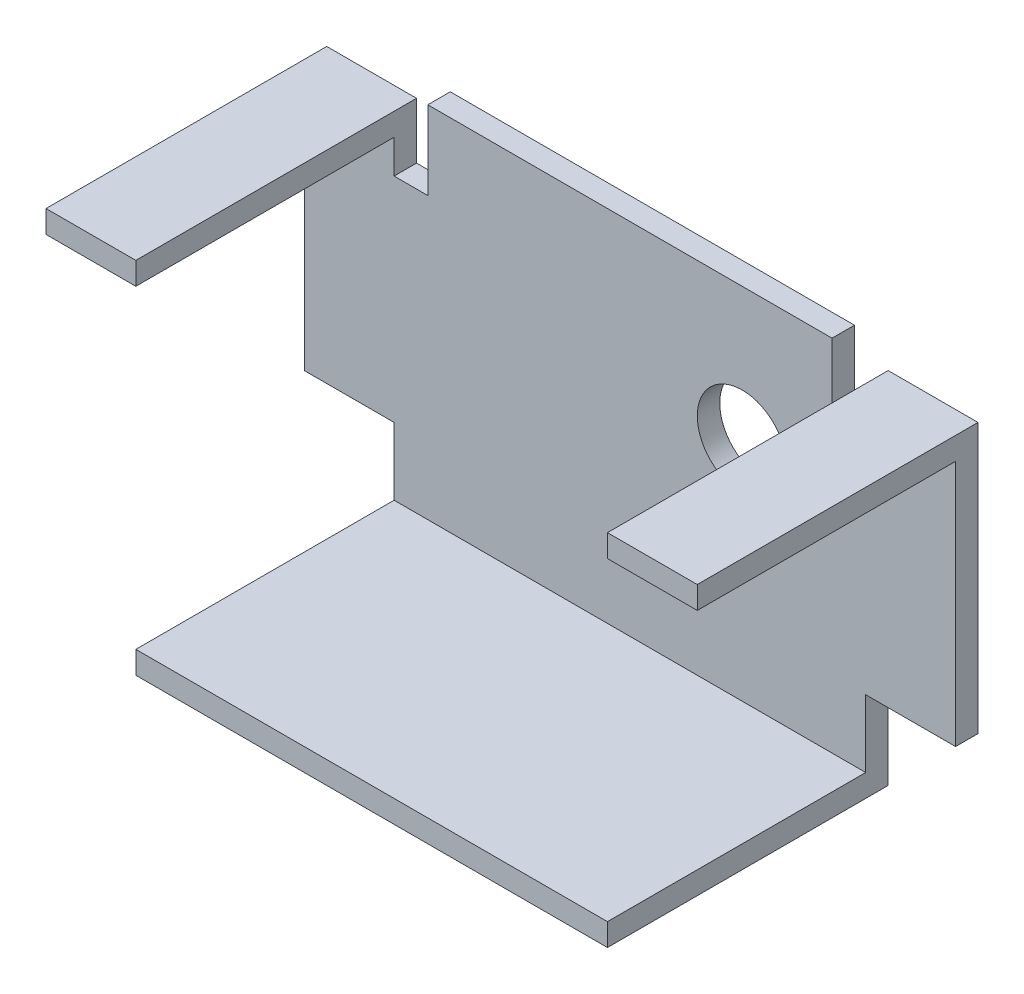
ISO-10303-21;
HEADER;
FILE_DESCRIPTION(('STEP AP214'),'2;1');
FILE_NAME('part.step','',(''),(''),'','','');
FILE_SCHEMA(('AUTOMOTIVE_DESIGN { 1 0 10303 214 1 1 1 1 }'));
ENDSEC;
DATA;
#1=APPLICATION_CONTEXT('core data for automotive mechanical design processes');
#2=APPLICATION_PROTOCOL_DEFINITION('international standard','automotive_design',2000,#1);
#3=PRODUCT_CONTEXT('',#1,'mechanical');
#4=PRODUCT('Part','Part','',(#3));
#5=PRODUCT_RELATED_PRODUCT_CATEGORY('part','',(#4));
#6=PRODUCT_DEFINITION_FORMATION('','',#4);
#7=PRODUCT_DEFINITION_CONTEXT('part definition',#1,'design');
#8=PRODUCT_DEFINITION('design','',#6,#7);
#9=PRODUCT_DEFINITION_SHAPE('','',#8);
#10=(LENGTH_UNIT() NAMED_UNIT(*) SI_UNIT(.MILLI.,.METRE.));
#11=(NAMED_UNIT(*) PLANE_ANGLE_UNIT() SI_UNIT($,.RADIAN.));
#12=(NAMED_UNIT(*) SI_UNIT($,.STERADIAN.) SOLID_ANGLE_UNIT());
#13=UNCERTAINTY_MEASURE_WITH_UNIT(LENGTH_MEASURE(1.E-05),#10,'distance_accuracy_value','');
#14=(GEOMETRIC_REPRESENTATION_CONTEXT(3) GLOBAL_UNCERTAINTY_ASSIGNED_CONTEXT((#13)) GLOBAL_UNIT_ASSIGNED_CONTEXT((#10,
#11,#12)) REPRESENTATION_CONTEXT('',''));
#15=CARTESIAN_POINT('',(0.,0.,0.));
#16=DIRECTION('',(0.,0.,1.));
#17=DIRECTION('',(1.,0.,0.));
#18=AXIS2_PLACEMENT_3D('',#15,#16,#17);
#19=CARTESIAN_POINT('',(0.,0.,-23.));
#20=DIRECTION('',(0.,0.,-1.));
#21=DIRECTION('',(-1.,0.,0.));
#22=AXIS2_PLACEMENT_3D('',#19,#20,#21);
#23=PLANE('',#22);
#24=CARTESIAN_POINT('',(-11.,21.9999999998767,-23.));
#25=DIRECTION('',(0.,0.,1.));
#26=DIRECTION('',(1.,0.,0.));
#27=AXIS2_PLACEMENT_3D('',#24,#25,#26);
#28=CIRCLE('',#27,4.);
#29=CARTESIAN_POINT('',(-7.,21.9999999998767,-23.));
#30=VERTEX_POINT('',#29);
#31=EDGE_CURVE('E385',#30,#30,#28,.T.);
#32=ORIENTED_EDGE('',*,*,#31,.F.);
#33=EDGE_LOOP('',(#32));
#34=FACE_BOUND('',#33,.T.);
#35=DIRECTION('',(1.,0.,0.));
#36=VECTOR('',#35,1.);
#37=CARTESIAN_POINT('',(8.,30.,-23.));
#38=LINE('',#37,#36);
#39=CARTESIAN_POINT('',(0.,30.,-23.));
#40=VERTEX_POINT('',#39);
#41=CARTESIAN_POINT('',(8.,30.,-23.));
#42=VERTEX_POINT('',#41);
#43=EDGE_CURVE('E191',#40,#42,#38,.T.);
#44=ORIENTED_EDGE('',*,*,#43,.F.);
#45=DIRECTION('',(0.,-1.,0.));
#46=VECTOR('',#45,1.);
#47=CARTESIAN_POINT('',(0.,32.,-23.));
#48=LINE('',#47,#46);
#49=CARTESIAN_POINT('',(0.,27.,-23.));
#50=VERTEX_POINT('',#49);
#51=EDGE_CURVE('E176',#40,#50,#48,.T.);
#52=ORIENTED_EDGE('',*,*,#51,.T.);
#53=DIRECTION('',(-1.,0.,0.));
#54=VECTOR('',#53,1.);
#55=CARTESIAN_POINT('',(0.,27.,-23.));
#56=LINE('',#55,#54);
#57=CARTESIAN_POINT('',(-3.,27.,-23.));
#58=VERTEX_POINT('',#57);
#59=EDGE_CURVE('E398',#50,#58,#56,.T.);
#60=ORIENTED_EDGE('',*,*,#59,.T.);
#61=DIRECTION('',(0.,1.,0.));
#62=VECTOR('',#61,1.);
#63=CARTESIAN_POINT('',(-3.,27.,-23.));
#64=LINE('',#63,#62);
#65=CARTESIAN_POINT('',(-3.,33.9999999998767,-23.));
#66=VERTEX_POINT('',#65);
#67=EDGE_CURVE('E390',#58,#66,#64,.T.);
#68=ORIENTED_EDGE('',*,*,#67,.T.);
#69=DIRECTION('',(-1.,0.,0.));
#70=VECTOR('',#69,1.);
#71=CARTESIAN_POINT('',(-3.,33.9999999998767,-23.));
#72=LINE('',#71,#70);
#73=CARTESIAN_POINT('',(-39.0000003932175,33.9999999998767,-23.));
#74=VERTEX_POINT('',#73);
#75=EDGE_CURVE('E413',#66,#74,#72,.T.);
#76=ORIENTED_EDGE('',*,*,#75,.T.);
#77=DIRECTION('',(0.,1.,0.));
#78=VECTOR('',#77,1.);
#79=CARTESIAN_POINT('',(-39.0000003932176,26.9999999998767,-23.));
#80=LINE('',#79,#78);
#81=CARTESIAN_POINT('',(-39.0000003932176,26.9999999998767,-23.));
#82=VERTEX_POINT('',#81);
#83=EDGE_CURVE('E420',#82,#74,#80,.T.);
#84=ORIENTED_EDGE('',*,*,#83,.F.);
#85=DIRECTION('',(1.,0.,0.));
#86=VECTOR('',#85,1.);
#87=CARTESIAN_POINT('',(-42.0000003932176,26.9999999998767,-23.));
#88=LINE('',#87,#86);
#89=CARTESIAN_POINT('',(-42.0000003932176,26.9999999998767,-23.));
#90=VERTEX_POINT('',#89);
#91=EDGE_CURVE('E445',#90,#82,#88,.T.);
#92=ORIENTED_EDGE('',*,*,#91,.F.);
#93=DIRECTION('',(0.,-1.,0.));
#94=VECTOR('',#93,1.);
#95=CARTESIAN_POINT('',(-42.0000003932176,31.9999999998767,-23.));
#96=LINE('',#95,#94);
#97=CARTESIAN_POINT('',(-42.0000003932176,29.9974917174477,-23.));
#98=VERTEX_POINT('',#97);
#99=EDGE_CURVE('E462',#98,#90,#96,.T.);
#100=ORIENTED_EDGE('',*,*,#99,.F.);
#101=DIRECTION('',(1.,0.,0.));
#102=VECTOR('',#101,1.);
#103=CARTESIAN_POINT('',(-50.,29.9974917174477,-23.));
#104=LINE('',#103,#102);
#105=CARTESIAN_POINT('',(-50.,29.9974917174477,-23.));
#106=VERTEX_POINT('',#105);
#107=EDGE_CURVE('E357',#106,#98,#104,.T.);
#108=ORIENTED_EDGE('',*,*,#107,.F.);
#109=DIRECTION('',(0.,1.,0.));
#110=VECTOR('',#109,1.);
#111=CARTESIAN_POINT('',(-50.,8.,-23.));
#112=LINE('',#111,#110);
#113=CARTESIAN_POINT('',(-50.,8.,-23.));
#114=VERTEX_POINT('',#113);
#115=EDGE_CURVE('E546',#114,#106,#112,.T.);
#116=ORIENTED_EDGE('',*,*,#115,.F.);
#117=DIRECTION('',(-1.,0.,0.));
#118=VECTOR('',#117,1.);
#119=CARTESIAN_POINT('',(-42.,8.,-23.));
#120=LINE('',#119,#118);
#121=CARTESIAN_POINT('',(-42.,8.,-23.));
#122=VERTEX_POINT('',#121);
#123=EDGE_CURVE('E557',#122,#114,#120,.T.);
#124=ORIENTED_EDGE('',*,*,#123,.F.);
#125=DIRECTION('',(0.,1.,0.));
#126=VECTOR('',#125,1.);
#127=CARTESIAN_POINT('',(-42.,2.,-23.));
#128=LINE('',#127,#126);
#129=CARTESIAN_POINT('',(-42.,2.,-23.));
#130=VERTEX_POINT('',#129);
#131=EDGE_CURVE('E565',#130,#122,#128,.T.);
#132=ORIENTED_EDGE('',*,*,#131,.F.);
#133=DIRECTION('',(1.,0.,0.));
#134=VECTOR('',#133,1.);
#135=CARTESIAN_POINT('',(-42.,2.,-23.));
#136=LINE('',#135,#134);
#137=CARTESIAN_POINT('',(0.,2.,-23.));
#138=VERTEX_POINT('',#137);
#139=EDGE_CURVE('E569',#130,#138,#136,.T.);
#140=ORIENTED_EDGE('',*,*,#139,.T.);
#141=DIRECTION('',(0.,1.,0.));
#142=VECTOR('',#141,1.);
#143=CARTESIAN_POINT('',(0.,2.,-23.));
#144=LINE('',#143,#142);
#145=CARTESIAN_POINT('',(0.,8.,-23.));
#146=VERTEX_POINT('',#145);
#147=EDGE_CURVE('E533',#138,#146,#144,.T.);
#148=ORIENTED_EDGE('',*,*,#147,.T.);
#149=DIRECTION('',(1.,0.,0.));
#150=VECTOR('',#149,1.);
#151=CARTESIAN_POINT('',(0.,8.,-23.));
#152=LINE('',#151,#150);
#153=CARTESIAN_POINT('',(8.,8.,-23.));
#154=VERTEX_POINT('',#153);
#155=EDGE_CURVE('E581',#146,#154,#152,.T.);
#156=ORIENTED_EDGE('',*,*,#155,.T.);
#157=DIRECTION('',(0.,1.,0.));
#158=VECTOR('',#157,1.);
#159=CARTESIAN_POINT('',(8.,8.,-23.));
#160=LINE('',#159,#158);
#161=EDGE_CURVE('E196',#154,#42,#160,.T.);
#162=ORIENTED_EDGE('',*,*,#161,.T.);
#163=EDGE_LOOP('',(#44,#52,#60,#68,#76,#84,#92,#100,#108,#116,#124,#132,#140,#148,#156,#162));
#164=FACE_BOUND('',#163,.T.);
#165=ADVANCED_FACE('F172',(#34,#164),#23,.F.);
#166=CARTESIAN_POINT('',(0.,2.,0.));
#167=DIRECTION('',(0.,-1.,0.));
#168=DIRECTION('',(0.,0.,-1.));
#169=AXIS2_PLACEMENT_3D('',#166,#167,#168);
#170=PLANE('',#169);
#171=ORIENTED_EDGE('',*,*,#139,.F.);
#172=DIRECTION('',(0.,0.,1.));
#173=VECTOR('',#172,1.);
#174=CARTESIAN_POINT('',(-42.,2.,0.));
#175=LINE('',#174,#173);
#176=CARTESIAN_POINT('',(-42.,2.,0.));
#177=VERTEX_POINT('',#176);
#178=EDGE_CURVE('E485',#130,#177,#175,.T.);
#179=ORIENTED_EDGE('',*,*,#178,.T.);
#180=DIRECTION('',(1.,0.,0.));
#181=VECTOR('',#180,1.);
#182=CARTESIAN_POINT('',(0.,2.,0.));
#183=LINE('',#182,#181);
#184=CARTESIAN_POINT('',(0.,2.,0.));
#185=VERTEX_POINT('',#184);
#186=EDGE_CURVE('E489',#177,#185,#183,.T.);
#187=ORIENTED_EDGE('',*,*,#186,.T.);
#188=DIRECTION('',(0.,0.,-1.));
#189=VECTOR('',#188,1.);
#190=CARTESIAN_POINT('',(0.,2.,-25.));
#191=LINE('',#190,#189);
#192=EDGE_CURVE('E490',#185,#138,#191,.T.);
#193=ORIENTED_EDGE('',*,*,#192,.T.);
#194=EDGE_LOOP('',(#171,#179,#187,#193));
#195=FACE_BOUND('',#194,.T.);
#196=ADVANCED_FACE('F716',(#195),#170,.F.);
#197=CARTESIAN_POINT('',(0.,2.,-25.));
#198=DIRECTION('',(-1.,0.,0.));
#199=DIRECTION('',(0.,0.,1.));
#200=AXIS2_PLACEMENT_3D('',#197,#198,#199);
#201=PLANE('',#200);
#202=DIRECTION('',(0.,0.,-1.));
#203=VECTOR('',#202,1.);
#204=CARTESIAN_POINT('',(0.,0.,-25.));
#205=LINE('',#204,#203);
#206=CARTESIAN_POINT('',(0.,0.,0.));
#207=VERTEX_POINT('',#206);
#208=CARTESIAN_POINT('',(0.,0.,-25.));
#209=VERTEX_POINT('',#208);
#210=EDGE_CURVE('E412',#207,#209,#205,.T.);
#211=ORIENTED_EDGE('',*,*,#210,.T.);
#212=DIRECTION('',(0.,-1.,0.));
#213=VECTOR('',#212,1.);
#214=CARTESIAN_POINT('',(0.,2.,-25.));
#215=LINE('',#214,#213);
#216=CARTESIAN_POINT('',(0.,8.,-25.));
#217=VERTEX_POINT('',#216);
#218=EDGE_CURVE('E12',#217,#209,#215,.T.);
#219=ORIENTED_EDGE('',*,*,#218,.F.);
#220=DIRECTION('',(0.,0.,1.));
#221=VECTOR('',#220,1.);
#222=CARTESIAN_POINT('',(0.,8.,-25.));
#223=LINE('',#222,#221);
#224=EDGE_CURVE('E578',#217,#146,#223,.T.);
#225=ORIENTED_EDGE('',*,*,#224,.T.);
#226=ORIENTED_EDGE('',*,*,#147,.F.);
#227=ORIENTED_EDGE('',*,*,#192,.F.);
#228=DIRECTION('',(0.,-1.,0.));
#229=VECTOR('',#228,1.);
#230=CARTESIAN_POINT('',(0.,2.,0.));
#231=LINE('',#230,#229);
#232=EDGE_CURVE('E499',#185,#207,#231,.T.);
#233=ORIENTED_EDGE('',*,*,#232,.T.);
#234=EDGE_LOOP('',(#211,#219,#225,#226,#227,#233));
#235=FACE_BOUND('',#234,.T.);
#236=ADVANCED_FACE('F174',(#235),#201,.F.);
#237=CARTESIAN_POINT('',(-42.,2.,-25.));
#238=DIRECTION('',(0.,0.,1.));
#239=DIRECTION('',(1.,0.,0.));
#240=AXIS2_PLACEMENT_3D('',#237,#238,#239);
#241=PLANE('',#240);
#242=CARTESIAN_POINT('',(-11.,21.9999999998767,-25.));
#243=DIRECTION('',(0.,0.,1.));
#244=DIRECTION('',(1.,0.,0.));
#245=AXIS2_PLACEMENT_3D('',#242,#243,#244);
#246=CIRCLE('',#245,4.);
#247=CARTESIAN_POINT('',(-7.,21.9999999998767,-25.));
#248=VERTEX_POINT('',#247);
#249=EDGE_CURVE('E386',#248,#248,#246,.T.);
#250=ORIENTED_EDGE('',*,*,#249,.T.);
#251=EDGE_LOOP('',(#250));
#252=FACE_BOUND('',#251,.T.);
#253=DIRECTION('',(-1.,0.,0.));
#254=VECTOR('',#253,1.);
#255=CARTESIAN_POINT('',(-42.,0.,-25.));
#256=LINE('',#255,#254);
#257=CARTESIAN_POINT('',(-42.,0.,-25.));
#258=VERTEX_POINT('',#257);
#259=EDGE_CURVE('E503',#209,#258,#256,.T.);
#260=ORIENTED_EDGE('',*,*,#259,.T.);
#261=DIRECTION('',(0.,-1.,0.));
#262=VECTOR('',#261,1.);
#263=CARTESIAN_POINT('',(-42.,2.,-25.));
#264=LINE('',#263,#262);
#265=CARTESIAN_POINT('',(-42.,8.,-25.));
#266=VERTEX_POINT('',#265);
#267=EDGE_CURVE('E183',#266,#258,#264,.T.);
#268=ORIENTED_EDGE('',*,*,#267,.F.);
#269=DIRECTION('',(-1.,0.,0.));
#270=VECTOR('',#269,1.);
#271=CARTESIAN_POINT('',(-42.,8.,-25.));
#272=LINE('',#271,#270);
#273=CARTESIAN_POINT('',(-50.,8.,-25.));
#274=VERTEX_POINT('',#273);
#275=EDGE_CURVE('E554',#266,#274,#272,.T.);
#276=ORIENTED_EDGE('',*,*,#275,.T.);
#277=DIRECTION('',(0.,1.,0.));
#278=VECTOR('',#277,1.);
#279=CARTESIAN_POINT('',(-50.,8.,-25.));
#280=LINE('',#279,#278);
#281=CARTESIAN_POINT('',(-50.,31.9974917174477,-25.));
#282=VERTEX_POINT('',#281);
#283=EDGE_CURVE('E543',#274,#282,#280,.T.);
#284=ORIENTED_EDGE('',*,*,#283,.T.);
#285=DIRECTION('',(0.999999950847806,0.000313535303626128,0.));
#286=VECTOR('',#285,1.);
#287=CARTESIAN_POINT('',(-50.,31.9974917174477,-25.));
#288=LINE('',#287,#286);
#289=CARTESIAN_POINT('',(-42.0000003932176,31.9999999998767,-25.));
#290=VERTEX_POINT('',#289);
#291=EDGE_CURVE('E472',#282,#290,#288,.T.);
#292=ORIENTED_EDGE('',*,*,#291,.T.);
#293=DIRECTION('',(0.,-1.,0.));
#294=VECTOR('',#293,1.);
#295=CARTESIAN_POINT('',(-42.0000003932176,31.9999999998767,-25.));
#296=LINE('',#295,#294);
#297=CARTESIAN_POINT('',(-42.0000003932176,26.9999999998767,-25.));
#298=VERTEX_POINT('',#297);
#299=EDGE_CURVE('E459',#290,#298,#296,.T.);
#300=ORIENTED_EDGE('',*,*,#299,.T.);
#301=DIRECTION('',(1.,0.,0.));
#302=VECTOR('',#301,1.);
#303=CARTESIAN_POINT('',(-42.0000003932176,26.9999999998767,-25.));
#304=LINE('',#303,#302);
#305=CARTESIAN_POINT('',(-39.0000003932176,26.9999999998767,-25.));
#306=VERTEX_POINT('',#305);
#307=EDGE_CURVE('E442',#298,#306,#304,.T.);
#308=ORIENTED_EDGE('',*,*,#307,.T.);
#309=DIRECTION('',(0.,1.,0.));
#310=VECTOR('',#309,1.);
#311=CARTESIAN_POINT('',(-39.0000003932176,26.9999999998767,-25.));
#312=LINE('',#311,#310);
#313=CARTESIAN_POINT('',(-39.0000003932175,33.9999999998767,-25.));
#314=VERTEX_POINT('',#313);
#315=EDGE_CURVE('E416',#306,#314,#312,.T.);
#316=ORIENTED_EDGE('',*,*,#315,.T.);
#317=DIRECTION('',(-1.,0.,0.));
#318=VECTOR('',#317,1.);
#319=CARTESIAN_POINT('',(-3.,33.9999999998767,-25.));
#320=LINE('',#319,#318);
#321=CARTESIAN_POINT('',(-3.,33.9999999998767,-25.));
#322=VERTEX_POINT('',#321);
#323=EDGE_CURVE('E408',#322,#314,#320,.T.);
#324=ORIENTED_EDGE('',*,*,#323,.F.);
#325=DIRECTION('',(0.,1.,0.));
#326=VECTOR('',#325,1.);
#327=CARTESIAN_POINT('',(-3.,27.,-25.));
#328=LINE('',#327,#326);
#329=CARTESIAN_POINT('',(-3.,27.,-25.));
#330=VERTEX_POINT('',#329);
#331=EDGE_CURVE('E399',#330,#322,#328,.T.);
#332=ORIENTED_EDGE('',*,*,#331,.F.);
#333=DIRECTION('',(-1.,0.,0.));
#334=VECTOR('',#333,1.);
#335=CARTESIAN_POINT('',(0.,27.,-25.));
#336=LINE('',#335,#334);
#337=CARTESIAN_POINT('',(0.,27.,-25.));
#338=VERTEX_POINT('',#337);
#339=EDGE_CURVE('E601',#338,#330,#336,.T.);
#340=ORIENTED_EDGE('',*,*,#339,.F.);
#341=DIRECTION('',(0.,-1.,0.));
#342=VECTOR('',#341,1.);
#343=CARTESIAN_POINT('',(0.,32.,-25.));
#344=LINE('',#343,#342);
#345=CARTESIAN_POINT('',(0.,32.,-25.));
#346=VERTEX_POINT('',#345);
#347=EDGE_CURVE('E336',#346,#338,#344,.T.);
#348=ORIENTED_EDGE('',*,*,#347,.F.);
#349=DIRECTION('',(-1.,0.,0.));
#350=VECTOR('',#349,1.);
#351=CARTESIAN_POINT('',(8.,32.,-25.));
#352=LINE('',#351,#350);
#353=CARTESIAN_POINT('',(8.,32.,-25.));
#354=VERTEX_POINT('',#353);
#355=EDGE_CURVE('E335',#354,#346,#352,.T.);
#356=ORIENTED_EDGE('',*,*,#355,.F.);
#357=DIRECTION('',(0.,1.,0.));
#358=VECTOR('',#357,1.);
#359=CARTESIAN_POINT('',(8.,8.,-25.));
#360=LINE('',#359,#358);
#361=CARTESIAN_POINT('',(8.,8.,-25.));
#362=VERTEX_POINT('',#361);
#363=EDGE_CURVE('E330',#362,#354,#360,.T.);
#364=ORIENTED_EDGE('',*,*,#363,.F.);
#365=DIRECTION('',(1.,0.,0.));
#366=VECTOR('',#365,1.);
#367=CARTESIAN_POINT('',(0.,8.,-25.));
#368=LINE('',#367,#366);
#369=EDGE_CURVE('E574',#217,#362,#368,.T.);
#370=ORIENTED_EDGE('',*,*,#369,.F.);
#371=ORIENTED_EDGE('',*,*,#218,.T.);
#372=EDGE_LOOP('',(#260,#268,#276,#284,#292,#300,#308,#316,#324,#332,#340,#348,#356,#364,#370,#371));
#373=FACE_BOUND('',#372,.T.);
#374=ADVANCED_FACE('F679',(#252,#373),#241,.F.);
#375=CARTESIAN_POINT('',(-42.,2.,0.));
#376=DIRECTION('',(1.,0.,0.));
#377=DIRECTION('',(0.,0.,-1.));
#378=AXIS2_PLACEMENT_3D('',#375,#376,#377);
#379=PLANE('',#378);
#380=DIRECTION('',(0.,0.,1.));
#381=VECTOR('',#380,1.);
#382=CARTESIAN_POINT('',(-42.,0.,0.));
#383=LINE('',#382,#381);
#384=CARTESIAN_POINT('',(-42.,0.,0.));
#385=VERTEX_POINT('',#384);
#386=EDGE_CURVE('E506',#258,#385,#383,.T.);
#387=ORIENTED_EDGE('',*,*,#386,.T.);
#388=DIRECTION('',(0.,-1.,0.));
#389=VECTOR('',#388,1.);
#390=CARTESIAN_POINT('',(-42.,2.,0.));
#391=LINE('',#390,#389);
#392=EDGE_CURVE('E484',#177,#385,#391,.T.);
#393=ORIENTED_EDGE('',*,*,#392,.F.);
#394=ORIENTED_EDGE('',*,*,#178,.F.);
#395=ORIENTED_EDGE('',*,*,#131,.T.);
#396=DIRECTION('',(0.,0.,1.));
#397=VECTOR('',#396,1.);
#398=CARTESIAN_POINT('',(-42.,8.,-25.));
#399=LINE('',#398,#397);
#400=EDGE_CURVE('E561',#266,#122,#399,.T.);
#401=ORIENTED_EDGE('',*,*,#400,.F.);
#402=ORIENTED_EDGE('',*,*,#267,.T.);
#403=EDGE_LOOP('',(#387,#393,#394,#395,#401,#402));
#404=FACE_BOUND('',#403,.T.);
#405=ADVANCED_FACE('F715',(#404),#379,.F.);
#406=CARTESIAN_POINT('',(0.,2.,0.));
#407=DIRECTION('',(0.,0.,-1.));
#408=DIRECTION('',(-1.,0.,0.));
#409=AXIS2_PLACEMENT_3D('',#406,#407,#408);
#410=PLANE('',#409);
#411=DIRECTION('',(1.,0.,0.));
#412=VECTOR('',#411,1.);
#413=CARTESIAN_POINT('',(0.,0.,0.));
#414=LINE('',#413,#412);
#415=EDGE_CURVE('E509',#385,#207,#414,.T.);
#416=ORIENTED_EDGE('',*,*,#415,.T.);
#417=ORIENTED_EDGE('',*,*,#232,.F.);
#418=ORIENTED_EDGE('',*,*,#186,.F.);
#419=ORIENTED_EDGE('',*,*,#392,.T.);
#420=EDGE_LOOP('',(#416,#417,#418,#419));
#421=FACE_BOUND('',#420,.T.);
#422=ADVANCED_FACE('F520',(#421),#410,.F.);
#423=CARTESIAN_POINT('',(0.,0.,0.));
#424=DIRECTION('',(0.,-1.,0.));
#425=DIRECTION('',(0.,0.,-1.));
#426=AXIS2_PLACEMENT_3D('',#423,#424,#425);
#427=PLANE('',#426);
#428=ORIENTED_EDGE('',*,*,#210,.F.);
#429=ORIENTED_EDGE('',*,*,#415,.F.);
#430=ORIENTED_EDGE('',*,*,#386,.F.);
#431=ORIENTED_EDGE('',*,*,#259,.F.);
#432=EDGE_LOOP('',(#428,#429,#430,#431));
#433=FACE_BOUND('',#432,.T.);
#434=ADVANCED_FACE('F527',(#433),#427,.T.);
#435=CARTESIAN_POINT('',(-3.,27.,-25.));
#436=DIRECTION('',(1.,0.,0.));
#437=DIRECTION('',(0.,0.,-1.));
#438=AXIS2_PLACEMENT_3D('',#435,#436,#437);
#439=PLANE('',#438);
#440=ORIENTED_EDGE('',*,*,#67,.F.);
#441=DIRECTION('',(0.,0.,1.));
#442=VECTOR('',#441,1.);
#443=CARTESIAN_POINT('',(-3.,27.,-25.));
#444=LINE('',#443,#442);
#445=EDGE_CURVE('E405',#330,#58,#444,.T.);
#446=ORIENTED_EDGE('',*,*,#445,.F.);
#447=ORIENTED_EDGE('',*,*,#331,.T.);
#448=DIRECTION('',(0.,0.,1.));
#449=VECTOR('',#448,1.);
#450=CARTESIAN_POINT('',(-3.,33.9999999998767,-25.));
#451=LINE('',#450,#449);
#452=EDGE_CURVE('E394',#322,#66,#451,.T.);
#453=ORIENTED_EDGE('',*,*,#452,.T.);
#454=EDGE_LOOP('',(#440,#446,#447,#453));
#455=FACE_BOUND('',#454,.T.);
#456=ADVANCED_FACE('F671',(#455),#439,.T.);
#457=CARTESIAN_POINT('',(0.,27.,-25.));
#458=DIRECTION('',(0.,1.,0.));
#459=DIRECTION('',(0.,0.,1.));
#460=AXIS2_PLACEMENT_3D('',#457,#458,#459);
#461=PLANE('',#460);
#462=ORIENTED_EDGE('',*,*,#59,.F.);
#463=DIRECTION('',(0.,0.,1.));
#464=VECTOR('',#463,1.);
#465=CARTESIAN_POINT('',(0.,27.,-25.));
#466=LINE('',#465,#464);
#467=EDGE_CURVE('E604',#338,#50,#466,.T.);
#468=ORIENTED_EDGE('',*,*,#467,.F.);
#469=ORIENTED_EDGE('',*,*,#339,.T.);
#470=ORIENTED_EDGE('',*,*,#445,.T.);
#471=EDGE_LOOP('',(#462,#468,#469,#470));
#472=FACE_BOUND('',#471,.T.);
#473=ADVANCED_FACE('F668',(#472),#461,.T.);
#474=CARTESIAN_POINT('',(0.,32.,-25.));
#475=DIRECTION('',(-1.,0.,0.));
#476=DIRECTION('',(0.,-1.,0.));
#477=AXIS2_PLACEMENT_3D('',#474,#475,#476);
#478=PLANE('',#477);
#479=ORIENTED_EDGE('',*,*,#51,.F.);
#480=DIRECTION('',(0.,0.,-1.));
#481=VECTOR('',#480,1.);
#482=CARTESIAN_POINT('',(0.,30.,0.));
#483=LINE('',#482,#481);
#484=CARTESIAN_POINT('',(0.,30.,0.));
#485=VERTEX_POINT('',#484);
#486=EDGE_CURVE('E1007',#485,#40,#483,.T.);
#487=ORIENTED_EDGE('',*,*,#486,.F.);
#488=DIRECTION('',(0.,-1.,0.));
#489=VECTOR('',#488,1.);
#490=CARTESIAN_POINT('',(0.,30.,0.));
#491=LINE('',#490,#489);
#492=CARTESIAN_POINT('',(0.,32.,0.));
#493=VERTEX_POINT('',#492);
#494=EDGE_CURVE('E353',#493,#485,#491,.T.);
#495=ORIENTED_EDGE('',*,*,#494,.F.);
#496=DIRECTION('',(0.,0.,1.));
#497=VECTOR('',#496,1.);
#498=CARTESIAN_POINT('',(0.,32.,-25.));
#499=LINE('',#498,#497);
#500=EDGE_CURVE('E350',#346,#493,#499,.T.);
#501=ORIENTED_EDGE('',*,*,#500,.F.);
#502=ORIENTED_EDGE('',*,*,#347,.T.);
#503=ORIENTED_EDGE('',*,*,#467,.T.);
#504=EDGE_LOOP('',(#479,#487,#495,#501,#502,#503));
#505=FACE_BOUND('',#504,.T.);
#506=ADVANCED_FACE('F677',(#505),#478,.T.);
#507=CARTESIAN_POINT('',(8.,32.,-25.));
#508=DIRECTION('',(0.,1.,0.));
#509=DIRECTION('',(0.,0.,1.));
#510=AXIS2_PLACEMENT_3D('',#507,#508,#509);
#511=PLANE('',#510);
#512=ORIENTED_EDGE('',*,*,#500,.T.);
#513=DIRECTION('',(-1.,0.,0.));
#514=VECTOR('',#513,1.);
#515=CARTESIAN_POINT('',(0.,32.,0.));
#516=LINE('',#515,#514);
#517=CARTESIAN_POINT('',(8.,32.,0.));
#518=VERTEX_POINT('',#517);
#519=EDGE_CURVE('E341',#518,#493,#516,.T.);
#520=ORIENTED_EDGE('',*,*,#519,.F.);
#521=DIRECTION('',(0.,0.,1.));
#522=VECTOR('',#521,1.);
#523=CARTESIAN_POINT('',(8.,32.,-25.));
#524=LINE('',#523,#522);
#525=EDGE_CURVE('E324',#354,#518,#524,.T.);
#526=ORIENTED_EDGE('',*,*,#525,.F.);
#527=ORIENTED_EDGE('',*,*,#355,.T.);
#528=EDGE_LOOP('',(#512,#520,#526,#527));
#529=FACE_BOUND('',#528,.T.);
#530=ADVANCED_FACE('F348',(#529),#511,.T.);
#531=CARTESIAN_POINT('',(8.,8.,-25.));
#532=DIRECTION('',(1.,0.,0.));
#533=DIRECTION('',(0.,0.,-1.));
#534=AXIS2_PLACEMENT_3D('',#531,#532,#533);
#535=PLANE('',#534);
#536=ORIENTED_EDGE('',*,*,#161,.F.);
#537=DIRECTION('',(0.,0.,1.));
#538=VECTOR('',#537,1.);
#539=CARTESIAN_POINT('',(8.,8.,-25.));
#540=LINE('',#539,#538);
#541=EDGE_CURVE('E586',#362,#154,#540,.T.);
#542=ORIENTED_EDGE('',*,*,#541,.F.);
#543=ORIENTED_EDGE('',*,*,#363,.T.);
#544=ORIENTED_EDGE('',*,*,#525,.T.);
#545=DIRECTION('',(0.,1.,0.));
#546=VECTOR('',#545,1.);
#547=CARTESIAN_POINT('',(8.,32.,0.));
#548=LINE('',#547,#546);
#549=CARTESIAN_POINT('',(8.,30.,0.));
#550=VERTEX_POINT('',#549);
#551=EDGE_CURVE('E328',#550,#518,#548,.T.);
#552=ORIENTED_EDGE('',*,*,#551,.F.);
#553=DIRECTION('',(0.,0.,-1.));
#554=VECTOR('',#553,1.);
#555=CARTESIAN_POINT('',(8.,30.,0.));
#556=LINE('',#555,#554);
#557=EDGE_CURVE('E346',#550,#42,#556,.T.);
#558=ORIENTED_EDGE('',*,*,#557,.T.);
#559=EDGE_LOOP('',(#536,#542,#543,#544,#552,#558));
#560=FACE_BOUND('',#559,.T.);
#561=ADVANCED_FACE('F326',(#560),#535,.T.);
#562=CARTESIAN_POINT('',(0.,8.,-25.));
#563=DIRECTION('',(0.,-1.,0.));
#564=DIRECTION('',(0.,0.,-1.));
#565=AXIS2_PLACEMENT_3D('',#562,#563,#564);
#566=PLANE('',#565);
#567=ORIENTED_EDGE('',*,*,#155,.F.);
#568=ORIENTED_EDGE('',*,*,#224,.F.);
#569=ORIENTED_EDGE('',*,*,#369,.T.);
#570=ORIENTED_EDGE('',*,*,#541,.T.);
#571=EDGE_LOOP('',(#567,#568,#569,#570));
#572=FACE_BOUND('',#571,.T.);
#573=ADVANCED_FACE('F765',(#572),#566,.T.);
#574=CARTESIAN_POINT('',(-3.,33.9999999998767,-25.));
#575=DIRECTION('',(0.,1.,0.));
#576=DIRECTION('',(0.,0.,1.));
#577=AXIS2_PLACEMENT_3D('',#574,#575,#576);
#578=PLANE('',#577);
#579=ORIENTED_EDGE('',*,*,#75,.F.);
#580=ORIENTED_EDGE('',*,*,#452,.F.);
#581=ORIENTED_EDGE('',*,*,#323,.T.);
#582=DIRECTION('',(0.,0.,1.));
#583=VECTOR('',#582,1.);
#584=CARTESIAN_POINT('',(-39.0000003932176,33.9999999998767,-25.));
#585=LINE('',#584,#583);
#586=EDGE_CURVE('E419',#314,#74,#585,.T.);
#587=ORIENTED_EDGE('',*,*,#586,.T.);
#588=EDGE_LOOP('',(#579,#580,#581,#587));
#589=FACE_BOUND('',#588,.T.);
#590=ADVANCED_FACE('F683',(#589),#578,.T.);
#591=CARTESIAN_POINT('',(-42.,8.,-25.));
#592=DIRECTION('',(0.,1.,0.));
#593=DIRECTION('',(0.,0.,1.));
#594=AXIS2_PLACEMENT_3D('',#591,#592,#593);
#595=PLANE('',#594);
#596=ORIENTED_EDGE('',*,*,#123,.T.);
#597=DIRECTION('',(0.,0.,1.));
#598=VECTOR('',#597,1.);
#599=CARTESIAN_POINT('',(-50.,8.,-25.));
#600=LINE('',#599,#598);
#601=EDGE_CURVE('E550',#274,#114,#600,.T.);
#602=ORIENTED_EDGE('',*,*,#601,.F.);
#603=ORIENTED_EDGE('',*,*,#275,.F.);
#604=ORIENTED_EDGE('',*,*,#400,.T.);
#605=EDGE_LOOP('',(#596,#602,#603,#604));
#606=FACE_BOUND('',#605,.T.);
#607=ADVANCED_FACE('F712',(#606),#595,.F.);
#608=CARTESIAN_POINT('',(-50.,8.,-25.));
#609=DIRECTION('',(1.,0.,0.));
#610=DIRECTION('',(0.,0.,-1.));
#611=AXIS2_PLACEMENT_3D('',#608,#609,#610);
#612=PLANE('',#611);
#613=ORIENTED_EDGE('',*,*,#115,.T.);
#614=DIRECTION('',(0.,0.,-1.));
#615=VECTOR('',#614,1.);
#616=CARTESIAN_POINT('',(-50.,29.9974917174477,0.));
#617=LINE('',#616,#615);
#618=CARTESIAN_POINT('',(-50.,29.9974917174477,0.));
#619=VERTEX_POINT('',#618);
#620=EDGE_CURVE('E382',#619,#106,#617,.T.);
#621=ORIENTED_EDGE('',*,*,#620,.F.);
#622=DIRECTION('',(0.,-1.,0.));
#623=VECTOR('',#622,1.);
#624=CARTESIAN_POINT('',(-50.,31.9974917174477,0.));
#625=LINE('',#624,#623);
#626=CARTESIAN_POINT('',(-50.,31.9974917174477,0.));
#627=VERTEX_POINT('',#626);
#628=EDGE_CURVE('E366',#627,#619,#625,.T.);
#629=ORIENTED_EDGE('',*,*,#628,.F.);
#630=DIRECTION('',(0.,0.,1.));
#631=VECTOR('',#630,1.);
#632=CARTESIAN_POINT('',(-50.,31.9974917174477,-25.));
#633=LINE('',#632,#631);
#634=EDGE_CURVE('E541',#282,#627,#633,.T.);
#635=ORIENTED_EDGE('',*,*,#634,.F.);
#636=ORIENTED_EDGE('',*,*,#283,.F.);
#637=ORIENTED_EDGE('',*,*,#601,.T.);
#638=EDGE_LOOP('',(#613,#621,#629,#635,#636,#637));
#639=FACE_BOUND('',#638,.T.);
#640=ADVANCED_FACE('F705',(#639),#612,.F.);
#641=CARTESIAN_POINT('',(-50.,31.9974917174477,-25.));
#642=DIRECTION('',(0.000313535303626128,-0.999999950847806,0.));
#643=DIRECTION('',(0.999999950847806,0.000313535303626128,0.));
#644=AXIS2_PLACEMENT_3D('',#641,#642,#643);
#645=PLANE('',#644);
#646=ORIENTED_EDGE('',*,*,#634,.T.);
#647=DIRECTION('',(-0.999999950847805,-0.000313535303626128,0.));
#648=VECTOR('',#647,1.);
#649=CARTESIAN_POINT('',(-42.0000003932176,31.9999999998767,0.));
#650=LINE('',#649,#648);
#651=CARTESIAN_POINT('',(-42.0000003932176,31.9999999998767,0.));
#652=VERTEX_POINT('',#651);
#653=EDGE_CURVE('E362',#652,#627,#650,.T.);
#654=ORIENTED_EDGE('',*,*,#653,.F.);
#655=DIRECTION('',(0.,0.,1.));
#656=VECTOR('',#655,1.);
#657=CARTESIAN_POINT('',(-42.0000003932176,31.9999999998767,-25.));
#658=LINE('',#657,#656);
#659=EDGE_CURVE('E476',#290,#652,#658,.T.);
#660=ORIENTED_EDGE('',*,*,#659,.F.);
#661=ORIENTED_EDGE('',*,*,#291,.F.);
#662=EDGE_LOOP('',(#646,#654,#660,#661));
#663=FACE_BOUND('',#662,.T.);
#664=ADVANCED_FACE('F773',(#663),#645,.F.);
#665=CARTESIAN_POINT('',(-42.0000003932176,31.9999999998767,-25.));
#666=DIRECTION('',(-1.,0.,0.));
#667=DIRECTION('',(0.,0.,1.));
#668=AXIS2_PLACEMENT_3D('',#665,#666,#667);
#669=PLANE('',#668);
#670=ORIENTED_EDGE('',*,*,#659,.T.);
#671=DIRECTION('',(0.,1.,0.));
#672=VECTOR('',#671,1.);
#673=CARTESIAN_POINT('',(-42.0000003932176,29.9974917174477,0.));
#674=LINE('',#673,#672);
#675=CARTESIAN_POINT('',(-42.0000003932176,29.9974917174477,0.));
#676=VERTEX_POINT('',#675);
#677=EDGE_CURVE('E372',#676,#652,#674,.T.);
#678=ORIENTED_EDGE('',*,*,#677,.F.);
#679=DIRECTION('',(0.,0.,-1.));
#680=VECTOR('',#679,1.);
#681=CARTESIAN_POINT('',(-42.0000003932176,29.9974917174477,0.));
#682=LINE('',#681,#680);
#683=EDGE_CURVE('E376',#676,#98,#682,.T.);
#684=ORIENTED_EDGE('',*,*,#683,.T.);
#685=ORIENTED_EDGE('',*,*,#99,.T.);
#686=DIRECTION('',(0.,0.,1.));
#687=VECTOR('',#686,1.);
#688=CARTESIAN_POINT('',(-42.0000003932176,26.9999999998767,-25.));
#689=LINE('',#688,#687);
#690=EDGE_CURVE('E456',#298,#90,#689,.T.);
#691=ORIENTED_EDGE('',*,*,#690,.F.);
#692=ORIENTED_EDGE('',*,*,#299,.F.);
#693=EDGE_LOOP('',(#670,#678,#684,#685,#691,#692));
#694=FACE_BOUND('',#693,.T.);
#695=ADVANCED_FACE('F696',(#694),#669,.F.);
#696=CARTESIAN_POINT('',(-42.0000003932176,26.9999999998767,-25.));
#697=DIRECTION('',(0.,-1.,0.));
#698=DIRECTION('',(0.,0.,-1.));
#699=AXIS2_PLACEMENT_3D('',#696,#697,#698);
#700=PLANE('',#699);
#701=ORIENTED_EDGE('',*,*,#91,.T.);
#702=DIRECTION('',(0.,0.,1.));
#703=VECTOR('',#702,1.);
#704=CARTESIAN_POINT('',(-39.0000003932176,26.9999999998767,-25.));
#705=LINE('',#704,#703);
#706=EDGE_CURVE('E439',#306,#82,#705,.T.);
#707=ORIENTED_EDGE('',*,*,#706,.F.);
#708=ORIENTED_EDGE('',*,*,#307,.F.);
#709=ORIENTED_EDGE('',*,*,#690,.T.);
#710=EDGE_LOOP('',(#701,#707,#708,#709));
#711=FACE_BOUND('',#710,.T.);
#712=ADVANCED_FACE('F693',(#711),#700,.F.);
#713=CARTESIAN_POINT('',(-39.0000003932176,26.9999999998767,-25.));
#714=DIRECTION('',(1.,0.,0.));
#715=DIRECTION('',(0.,0.,-1.));
#716=AXIS2_PLACEMENT_3D('',#713,#714,#715);
#717=PLANE('',#716);
#718=ORIENTED_EDGE('',*,*,#83,.T.);
#719=ORIENTED_EDGE('',*,*,#586,.F.);
#720=ORIENTED_EDGE('',*,*,#315,.F.);
#721=ORIENTED_EDGE('',*,*,#706,.T.);
#722=EDGE_LOOP('',(#718,#719,#720,#721));
#723=FACE_BOUND('',#722,.T.);
#724=ADVANCED_FACE('F685',(#723),#717,.F.);
#725=CARTESIAN_POINT('',(-11.,21.9999999998767,-25.));
#726=DIRECTION('',(0.,0.,1.));
#727=DIRECTION('',(1.,0.,0.));
#728=AXIS2_PLACEMENT_3D('',#725,#726,#727);
#729=CYLINDRICAL_SURFACE('',#728,4.);
#730=ORIENTED_EDGE('',*,*,#249,.F.);
#731=EDGE_LOOP('',(#730));
#732=FACE_BOUND('',#731,.T.);
#733=ORIENTED_EDGE('',*,*,#31,.T.);
#734=EDGE_LOOP('',(#733));
#735=FACE_BOUND('',#734,.T.);
#736=ADVANCED_FACE('F740',(#732,#735),#729,.F.);
#737=CARTESIAN_POINT('',(-50.,29.9974917174477,0.));
#738=DIRECTION('',(0.,1.,0.));
#739=DIRECTION('',(0.,0.,1.));
#740=AXIS2_PLACEMENT_3D('',#737,#738,#739);
#741=PLANE('',#740);
#742=ORIENTED_EDGE('',*,*,#107,.T.);
#743=ORIENTED_EDGE('',*,*,#683,.F.);
#744=DIRECTION('',(1.,0.,0.));
#745=VECTOR('',#744,1.);
#746=CARTESIAN_POINT('',(-50.,29.9974917174477,0.));
#747=LINE('',#746,#745);
#748=EDGE_CURVE('E369',#619,#676,#747,.T.);
#749=ORIENTED_EDGE('',*,*,#748,.F.);
#750=ORIENTED_EDGE('',*,*,#620,.T.);
#751=EDGE_LOOP('',(#742,#743,#749,#750));
#752=FACE_BOUND('',#751,.T.);
#753=ADVANCED_FACE('F702',(#752),#741,.F.);
#754=CARTESIAN_POINT('',(0.,0.,0.));
#755=DIRECTION('',(0.,0.,1.));
#756=DIRECTION('',(1.,0.,0.));
#757=AXIS2_PLACEMENT_3D('',#754,#755,#756);
#758=PLANE('',#757);
#759=ORIENTED_EDGE('',*,*,#653,.T.);
#760=ORIENTED_EDGE('',*,*,#628,.T.);
#761=ORIENTED_EDGE('',*,*,#748,.T.);
#762=ORIENTED_EDGE('',*,*,#677,.T.);
#763=EDGE_LOOP('',(#759,#760,#761,#762));
#764=FACE_BOUND('',#763,.T.);
#765=ADVANCED_FACE('F748',(#764),#758,.T.);
#766=CARTESIAN_POINT('',(8.,30.,0.));
#767=DIRECTION('',(0.,1.,0.));
#768=DIRECTION('',(0.,0.,1.));
#769=AXIS2_PLACEMENT_3D('',#766,#767,#768);
#770=PLANE('',#769);
#771=ORIENTED_EDGE('',*,*,#43,.T.);
#772=ORIENTED_EDGE('',*,*,#557,.F.);
#773=DIRECTION('',(1.,0.,0.));
#774=VECTOR('',#773,1.);
#775=CARTESIAN_POINT('',(8.,30.,0.));
#776=LINE('',#775,#774);
#777=EDGE_CURVE('E343',#485,#550,#776,.T.);
#778=ORIENTED_EDGE('',*,*,#777,.F.);
#779=ORIENTED_EDGE('',*,*,#486,.T.);
#780=EDGE_LOOP('',(#771,#772,#778,#779));
#781=FACE_BOUND('',#780,.T.);
#782=ADVANCED_FACE('F844',(#781),#770,.F.);
#783=CARTESIAN_POINT('',(0.,0.,0.));
#784=DIRECTION('',(0.,0.,-1.));
#785=DIRECTION('',(-1.,0.,0.));
#786=AXIS2_PLACEMENT_3D('',#783,#784,#785);
#787=PLANE('',#786);
#788=ORIENTED_EDGE('',*,*,#519,.T.);
#789=ORIENTED_EDGE('',*,*,#494,.T.);
#790=ORIENTED_EDGE('',*,*,#777,.T.);
#791=ORIENTED_EDGE('',*,*,#551,.T.);
#792=EDGE_LOOP('',(#788,#789,#790,#791));
#793=FACE_BOUND('',#792,.T.);
#794=ADVANCED_FACE('F340',(#793),#787,.F.);
#795=CLOSED_SHELL('',(#165,#196,#236,#374,#405,#422,#434,#456,#473,#506,#530,#561,#573,#590,
#607,#640,#664,#695,#712,#724,#736,#753,#765,#782,#794));
#796=MANIFOLD_SOLID_BREP('B2',#795);
#797=ADVANCED_BREP_SHAPE_REPRESENTATION('',(#18,#796),#14);
#798=SHAPE_DEFINITION_REPRESENTATION(#9,#797);
ENDSEC;
END-ISO-10303-21;
